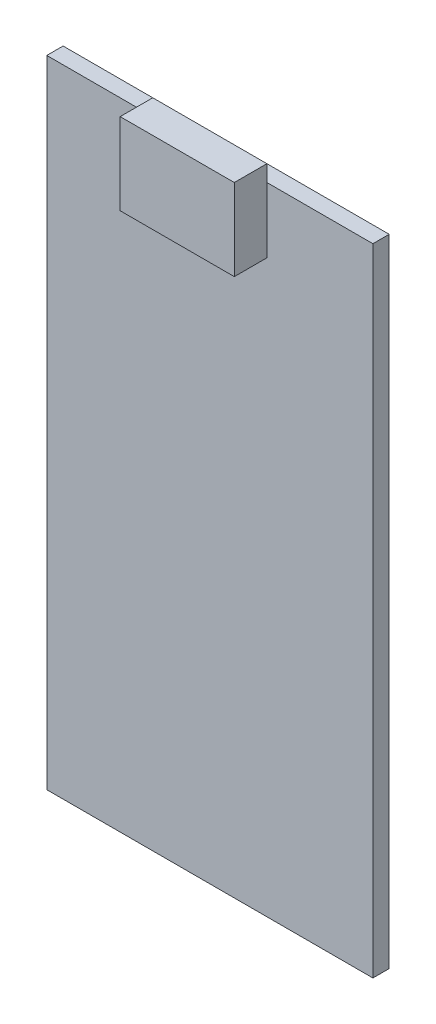
ISO-10303-21;
HEADER;
FILE_DESCRIPTION(('STEP AP214'),'2;1');
FILE_NAME('part.step','',(''),(''),'','','');
FILE_SCHEMA(('AUTOMOTIVE_DESIGN { 1 0 10303 214 1 1 1 1 }'));
ENDSEC;
DATA;
#1=APPLICATION_CONTEXT('core data for automotive mechanical design processes');
#2=APPLICATION_PROTOCOL_DEFINITION('international standard','automotive_design',2000,#1);
#3=PRODUCT_CONTEXT('',#1,'mechanical');
#4=PRODUCT('Part','Part','',(#3));
#5=PRODUCT_RELATED_PRODUCT_CATEGORY('part','',(#4));
#6=PRODUCT_DEFINITION_FORMATION('','',#4);
#7=PRODUCT_DEFINITION_CONTEXT('part definition',#1,'design');
#8=PRODUCT_DEFINITION('design','',#6,#7);
#9=PRODUCT_DEFINITION_SHAPE('','',#8);
#10=(LENGTH_UNIT() NAMED_UNIT(*) SI_UNIT(.MILLI.,.METRE.));
#11=(NAMED_UNIT(*) PLANE_ANGLE_UNIT() SI_UNIT($,.RADIAN.));
#12=(NAMED_UNIT(*) SI_UNIT($,.STERADIAN.) SOLID_ANGLE_UNIT());
#13=UNCERTAINTY_MEASURE_WITH_UNIT(LENGTH_MEASURE(1.E-05),#10,'distance_accuracy_value','');
#14=(GEOMETRIC_REPRESENTATION_CONTEXT(3) GLOBAL_UNCERTAINTY_ASSIGNED_CONTEXT((#13)) GLOBAL_UNIT_ASSIGNED_CONTEXT((#10,
#11,#12)) REPRESENTATION_CONTEXT('',''));
#15=CARTESIAN_POINT('',(0.,0.,0.));
#16=DIRECTION('',(0.,0.,1.));
#17=DIRECTION('',(1.,0.,0.));
#18=AXIS2_PLACEMENT_3D('',#15,#16,#17);
#19=CARTESIAN_POINT('',(-10.,-19.5,1.));
#20=DIRECTION('',(1.,0.,0.));
#21=DIRECTION('',(0.,1.,0.));
#22=AXIS2_PLACEMENT_3D('',#19,#20,#21);
#23=PLANE('',#22);
#24=DIRECTION('',(0.,-1.,0.));
#25=VECTOR('',#24,1.);
#26=CARTESIAN_POINT('',(-10.,-19.5,0.));
#27=LINE('',#26,#25);
#28=CARTESIAN_POINT('',(-10.,19.5,0.));
#29=VERTEX_POINT('',#28);
#30=CARTESIAN_POINT('',(-10.,-19.5,0.));
#31=VERTEX_POINT('',#30);
#32=EDGE_CURVE('E130',#29,#31,#27,.T.);
#33=ORIENTED_EDGE('',*,*,#32,.T.);
#34=DIRECTION('',(0.,0.,-1.));
#35=VECTOR('',#34,1.);
#36=CARTESIAN_POINT('',(-10.,-19.5,1.));
#37=LINE('',#36,#35);
#38=CARTESIAN_POINT('',(-10.,-19.5,1.));
#39=VERTEX_POINT('',#38);
#40=EDGE_CURVE('E42',#39,#31,#37,.T.);
#41=ORIENTED_EDGE('',*,*,#40,.F.);
#42=DIRECTION('',(0.,-1.,0.));
#43=VECTOR('',#42,1.);
#44=CARTESIAN_POINT('',(-10.,-19.5,1.));
#45=LINE('',#44,#43);
#46=CARTESIAN_POINT('',(-10.,19.5,1.));
#47=VERTEX_POINT('',#46);
#48=EDGE_CURVE('E139',#47,#39,#45,.T.);
#49=ORIENTED_EDGE('',*,*,#48,.F.);
#50=DIRECTION('',(0.,0.,-1.));
#51=VECTOR('',#50,1.);
#52=CARTESIAN_POINT('',(-10.,19.5,1.));
#53=LINE('',#52,#51);
#54=EDGE_CURVE('E150',#47,#29,#53,.T.);
#55=ORIENTED_EDGE('',*,*,#54,.T.);
#56=EDGE_LOOP('',(#33,#41,#49,#55));
#57=FACE_BOUND('',#56,.T.);
#58=ADVANCED_FACE('F39',(#57),#23,.F.);
#59=CARTESIAN_POINT('',(10.,-19.5,1.));
#60=DIRECTION('',(0.,1.,0.));
#61=DIRECTION('',(-1.,0.,0.));
#62=AXIS2_PLACEMENT_3D('',#59,#60,#61);
#63=PLANE('',#62);
#64=DIRECTION('',(1.,0.,0.));
#65=VECTOR('',#64,1.);
#66=CARTESIAN_POINT('',(10.,-19.5,0.));
#67=LINE('',#66,#65);
#68=CARTESIAN_POINT('',(10.,-19.5,0.));
#69=VERTEX_POINT('',#68);
#70=EDGE_CURVE('E133',#31,#69,#67,.T.);
#71=ORIENTED_EDGE('',*,*,#70,.T.);
#72=DIRECTION('',(0.,0.,-1.));
#73=VECTOR('',#72,1.);
#74=CARTESIAN_POINT('',(10.,-19.5,1.));
#75=LINE('',#74,#73);
#76=CARTESIAN_POINT('',(10.,-19.5,1.));
#77=VERTEX_POINT('',#76);
#78=EDGE_CURVE('E161',#77,#69,#75,.T.);
#79=ORIENTED_EDGE('',*,*,#78,.F.);
#80=DIRECTION('',(1.,0.,0.));
#81=VECTOR('',#80,1.);
#82=CARTESIAN_POINT('',(10.,-19.5,1.));
#83=LINE('',#82,#81);
#84=EDGE_CURVE('E142',#39,#77,#83,.T.);
#85=ORIENTED_EDGE('',*,*,#84,.F.);
#86=ORIENTED_EDGE('',*,*,#40,.T.);
#87=EDGE_LOOP('',(#71,#79,#85,#86));
#88=FACE_BOUND('',#87,.T.);
#89=ADVANCED_FACE('F170',(#88),#63,.F.);
#90=CARTESIAN_POINT('',(10.,-19.5,1.));
#91=DIRECTION('',(-1.,0.,0.));
#92=DIRECTION('',(0.,0.,1.));
#93=AXIS2_PLACEMENT_3D('',#90,#91,#92);
#94=PLANE('',#93);
#95=DIRECTION('',(0.,1.,0.));
#96=VECTOR('',#95,1.);
#97=CARTESIAN_POINT('',(10.,-19.5,0.));
#98=LINE('',#97,#96);
#99=CARTESIAN_POINT('',(10.,19.5,0.));
#100=VERTEX_POINT('',#99);
#101=EDGE_CURVE('E154',#69,#100,#98,.T.);
#102=ORIENTED_EDGE('',*,*,#101,.T.);
#103=DIRECTION('',(0.,0.,-1.));
#104=VECTOR('',#103,1.);
#105=CARTESIAN_POINT('',(10.,19.5,1.));
#106=LINE('',#105,#104);
#107=CARTESIAN_POINT('',(10.,19.5,1.));
#108=VERTEX_POINT('',#107);
#109=EDGE_CURVE('E159',#108,#100,#106,.T.);
#110=ORIENTED_EDGE('',*,*,#109,.F.);
#111=DIRECTION('',(0.,1.,0.));
#112=VECTOR('',#111,1.);
#113=CARTESIAN_POINT('',(10.,-19.5,1.));
#114=LINE('',#113,#112);
#115=EDGE_CURVE('E145',#77,#108,#114,.T.);
#116=ORIENTED_EDGE('',*,*,#115,.F.);
#117=ORIENTED_EDGE('',*,*,#78,.T.);
#118=EDGE_LOOP('',(#102,#110,#116,#117));
#119=FACE_BOUND('',#118,.T.);
#120=ADVANCED_FACE('F179',(#119),#94,.F.);
#121=CARTESIAN_POINT('',(10.,19.5,1.));
#122=DIRECTION('',(0.,-1.,0.));
#123=DIRECTION('',(1.,0.,0.));
#124=AXIS2_PLACEMENT_3D('',#121,#122,#123);
#125=PLANE('',#124);
#126=DIRECTION('',(-1.,0.,0.));
#127=VECTOR('',#126,1.);
#128=CARTESIAN_POINT('',(10.,19.5,0.));
#129=LINE('',#128,#127);
#130=EDGE_CURVE('E143',#100,#29,#129,.T.);
#131=ORIENTED_EDGE('',*,*,#130,.T.);
#132=ORIENTED_EDGE('',*,*,#54,.F.);
#133=DIRECTION('',(-1.,0.,0.));
#134=VECTOR('',#133,1.);
#135=CARTESIAN_POINT('',(10.,19.5,1.));
#136=LINE('',#135,#134);
#137=CARTESIAN_POINT('',(-3.5,19.5,1.));
#138=VERTEX_POINT('',#137);
#139=EDGE_CURVE('E147',#138,#47,#136,.T.);
#140=ORIENTED_EDGE('',*,*,#139,.F.);
#141=CARTESIAN_POINT('',(3.5,19.5,1.));
#142=VERTEX_POINT('',#141);
#143=EDGE_CURVE('E151',#142,#138,#136,.T.);
#144=ORIENTED_EDGE('',*,*,#143,.F.);
#145=EDGE_CURVE('E148',#108,#142,#136,.T.);
#146=ORIENTED_EDGE('',*,*,#145,.F.);
#147=ORIENTED_EDGE('',*,*,#109,.T.);
#148=EDGE_LOOP('',(#131,#132,#140,#144,#146,#147));
#149=FACE_BOUND('',#148,.T.);
#150=ADVANCED_FACE('F182',(#149),#125,.F.);
#151=CARTESIAN_POINT('',(0.,0.,1.));
#152=DIRECTION('',(0.,0.,1.));
#153=DIRECTION('',(1.,0.,0.));
#154=AXIS2_PLACEMENT_3D('',#151,#152,#153);
#155=PLANE('',#154);
#156=DIRECTION('',(0.,-1.,0.));
#157=VECTOR('',#156,1.);
#158=CARTESIAN_POINT('',(-3.5,15.5,1.));
#159=LINE('',#158,#157);
#160=CARTESIAN_POINT('',(-3.5,15.5,1.));
#161=VERTEX_POINT('',#160);
#162=EDGE_CURVE('E11',#138,#161,#159,.T.);
#163=ORIENTED_EDGE('',*,*,#162,.F.);
#164=ORIENTED_EDGE('',*,*,#139,.T.);
#165=ORIENTED_EDGE('',*,*,#48,.T.);
#166=ORIENTED_EDGE('',*,*,#84,.T.);
#167=ORIENTED_EDGE('',*,*,#115,.T.);
#168=ORIENTED_EDGE('',*,*,#145,.T.);
#169=DIRECTION('',(0.,1.,0.));
#170=VECTOR('',#169,1.);
#171=CARTESIAN_POINT('',(3.5,15.5,1.));
#172=LINE('',#171,#170);
#173=CARTESIAN_POINT('',(3.5,15.5,1.));
#174=VERTEX_POINT('',#173);
#175=EDGE_CURVE('E187',#174,#142,#172,.T.);
#176=ORIENTED_EDGE('',*,*,#175,.F.);
#177=DIRECTION('',(1.,0.,0.));
#178=VECTOR('',#177,1.);
#179=CARTESIAN_POINT('',(3.5,15.5,1.));
#180=LINE('',#179,#178);
#181=EDGE_CURVE('E55',#161,#174,#180,.T.);
#182=ORIENTED_EDGE('',*,*,#181,.F.);
#183=EDGE_LOOP('',(#163,#164,#165,#166,#167,#168,#176,#182));
#184=FACE_BOUND('',#183,.T.);
#185=ADVANCED_FACE('F185',(#184),#155,.T.);
#186=CARTESIAN_POINT('',(0.,0.,0.));
#187=DIRECTION('',(0.,0.,1.));
#188=DIRECTION('',(1.,0.,0.));
#189=AXIS2_PLACEMENT_3D('',#186,#187,#188);
#190=PLANE('',#189);
#191=ORIENTED_EDGE('',*,*,#32,.F.);
#192=ORIENTED_EDGE('',*,*,#130,.F.);
#193=ORIENTED_EDGE('',*,*,#101,.F.);
#194=ORIENTED_EDGE('',*,*,#70,.F.);
#195=EDGE_LOOP('',(#191,#192,#193,#194));
#196=FACE_BOUND('',#195,.T.);
#197=ADVANCED_FACE('F177',(#196),#190,.F.);
#198=CARTESIAN_POINT('',(0.,0.,1.));
#199=DIRECTION('',(0.,0.,1.));
#200=DIRECTION('',(1.,0.,0.));
#201=AXIS2_PLACEMENT_3D('',#198,#199,#200);
#202=PLANE('',#201);
#203=CARTESIAN_POINT('',(3.5,20.5,1.));
#204=VERTEX_POINT('',#203);
#205=EDGE_CURVE('E190',#142,#204,#172,.T.);
#206=ORIENTED_EDGE('',*,*,#205,.F.);
#207=ORIENTED_EDGE('',*,*,#143,.T.);
#208=CARTESIAN_POINT('',(-3.5,20.5,1.));
#209=VERTEX_POINT('',#208);
#210=EDGE_CURVE('E48',#209,#138,#159,.T.);
#211=ORIENTED_EDGE('',*,*,#210,.F.);
#212=DIRECTION('',(-1.,0.,0.));
#213=VECTOR('',#212,1.);
#214=CARTESIAN_POINT('',(3.5,20.5,1.));
#215=LINE('',#214,#213);
#216=EDGE_CURVE('E126',#204,#209,#215,.T.);
#217=ORIENTED_EDGE('',*,*,#216,.F.);
#218=EDGE_LOOP('',(#206,#207,#211,#217));
#219=FACE_BOUND('',#218,.T.);
#220=ADVANCED_FACE('F191',(#219),#202,.F.);
#221=CARTESIAN_POINT('',(-3.5,15.5,3.));
#222=DIRECTION('',(1.,0.,0.));
#223=DIRECTION('',(0.,1.,0.));
#224=AXIS2_PLACEMENT_3D('',#221,#222,#223);
#225=PLANE('',#224);
#226=ORIENTED_EDGE('',*,*,#210,.T.);
#227=ORIENTED_EDGE('',*,*,#162,.T.);
#228=DIRECTION('',(0.,0.,-1.));
#229=VECTOR('',#228,1.);
#230=CARTESIAN_POINT('',(-3.5,15.5,3.));
#231=LINE('',#230,#229);
#232=CARTESIAN_POINT('',(-3.5,15.5,3.));
#233=VERTEX_POINT('',#232);
#234=EDGE_CURVE('E111',#233,#161,#231,.T.);
#235=ORIENTED_EDGE('',*,*,#234,.F.);
#236=DIRECTION('',(0.,-1.,0.));
#237=VECTOR('',#236,1.);
#238=CARTESIAN_POINT('',(-3.5,15.5,3.));
#239=LINE('',#238,#237);
#240=CARTESIAN_POINT('',(-3.5,20.5,3.));
#241=VERTEX_POINT('',#240);
#242=EDGE_CURVE('E117',#241,#233,#239,.T.);
#243=ORIENTED_EDGE('',*,*,#242,.F.);
#244=DIRECTION('',(0.,0.,-1.));
#245=VECTOR('',#244,1.);
#246=CARTESIAN_POINT('',(-3.5,20.5,3.));
#247=LINE('',#246,#245);
#248=EDGE_CURVE('E201',#241,#209,#247,.T.);
#249=ORIENTED_EDGE('',*,*,#248,.T.);
#250=EDGE_LOOP('',(#226,#227,#235,#243,#249));
#251=FACE_BOUND('',#250,.T.);
#252=ADVANCED_FACE('F129',(#251),#225,.F.);
#253=CARTESIAN_POINT('',(3.5,15.5,3.));
#254=DIRECTION('',(0.,1.,0.));
#255=DIRECTION('',(0.,0.,1.));
#256=AXIS2_PLACEMENT_3D('',#253,#254,#255);
#257=PLANE('',#256);
#258=ORIENTED_EDGE('',*,*,#181,.T.);
#259=DIRECTION('',(0.,0.,-1.));
#260=VECTOR('',#259,1.);
#261=CARTESIAN_POINT('',(3.5,15.5,3.));
#262=LINE('',#261,#260);
#263=CARTESIAN_POINT('',(3.5,15.5,3.));
#264=VERTEX_POINT('',#263);
#265=EDGE_CURVE('E113',#264,#174,#262,.T.);
#266=ORIENTED_EDGE('',*,*,#265,.F.);
#267=DIRECTION('',(1.,0.,0.));
#268=VECTOR('',#267,1.);
#269=CARTESIAN_POINT('',(3.5,15.5,3.));
#270=LINE('',#269,#268);
#271=EDGE_CURVE('E107',#233,#264,#270,.T.);
#272=ORIENTED_EDGE('',*,*,#271,.F.);
#273=ORIENTED_EDGE('',*,*,#234,.T.);
#274=EDGE_LOOP('',(#258,#266,#272,#273));
#275=FACE_BOUND('',#274,.T.);
#276=ADVANCED_FACE('F109',(#275),#257,.F.);
#277=CARTESIAN_POINT('',(3.5,15.5,3.));
#278=DIRECTION('',(-1.,0.,0.));
#279=DIRECTION('',(0.,-1.,0.));
#280=AXIS2_PLACEMENT_3D('',#277,#278,#279);
#281=PLANE('',#280);
#282=ORIENTED_EDGE('',*,*,#175,.T.);
#283=ORIENTED_EDGE('',*,*,#205,.T.);
#284=DIRECTION('',(0.,0.,-1.));
#285=VECTOR('',#284,1.);
#286=CARTESIAN_POINT('',(3.5,20.5,3.));
#287=LINE('',#286,#285);
#288=CARTESIAN_POINT('',(3.5,20.5,3.));
#289=VERTEX_POINT('',#288);
#290=EDGE_CURVE('E135',#289,#204,#287,.T.);
#291=ORIENTED_EDGE('',*,*,#290,.F.);
#292=DIRECTION('',(0.,1.,0.));
#293=VECTOR('',#292,1.);
#294=CARTESIAN_POINT('',(3.5,15.5,3.));
#295=LINE('',#294,#293);
#296=EDGE_CURVE('E116',#264,#289,#295,.T.);
#297=ORIENTED_EDGE('',*,*,#296,.F.);
#298=ORIENTED_EDGE('',*,*,#265,.T.);
#299=EDGE_LOOP('',(#282,#283,#291,#297,#298));
#300=FACE_BOUND('',#299,.T.);
#301=ADVANCED_FACE('F197',(#300),#281,.F.);
#302=CARTESIAN_POINT('',(3.5,20.5,3.));
#303=DIRECTION('',(0.,-1.,0.));
#304=DIRECTION('',(0.,0.,-1.));
#305=AXIS2_PLACEMENT_3D('',#302,#303,#304);
#306=PLANE('',#305);
#307=ORIENTED_EDGE('',*,*,#216,.T.);
#308=ORIENTED_EDGE('',*,*,#248,.F.);
#309=DIRECTION('',(-1.,0.,0.));
#310=VECTOR('',#309,1.);
#311=CARTESIAN_POINT('',(3.5,20.5,3.));
#312=LINE('',#311,#310);
#313=EDGE_CURVE('E122',#289,#241,#312,.T.);
#314=ORIENTED_EDGE('',*,*,#313,.F.);
#315=ORIENTED_EDGE('',*,*,#290,.T.);
#316=EDGE_LOOP('',(#307,#308,#314,#315));
#317=FACE_BOUND('',#316,.T.);
#318=ADVANCED_FACE('F203',(#317),#306,.F.);
#319=CARTESIAN_POINT('',(0.,0.,3.));
#320=DIRECTION('',(0.,0.,1.));
#321=DIRECTION('',(1.,0.,0.));
#322=AXIS2_PLACEMENT_3D('',#319,#320,#321);
#323=PLANE('',#322);
#324=ORIENTED_EDGE('',*,*,#242,.T.);
#325=ORIENTED_EDGE('',*,*,#271,.T.);
#326=ORIENTED_EDGE('',*,*,#296,.T.);
#327=ORIENTED_EDGE('',*,*,#313,.T.);
#328=EDGE_LOOP('',(#324,#325,#326,#327));
#329=FACE_BOUND('',#328,.T.);
#330=ADVANCED_FACE('F120',(#329),#323,.T.);
#331=CLOSED_SHELL('',(#58,#89,#120,#150,#185,#197,#220,#252,#276,#301,#318,#330));
#332=MANIFOLD_SOLID_BREP('B2',#331);
#333=ADVANCED_BREP_SHAPE_REPRESENTATION('',(#18,#332),#14);
#334=SHAPE_DEFINITION_REPRESENTATION(#9,#333);
ENDSEC;
END-ISO-10303-21;
